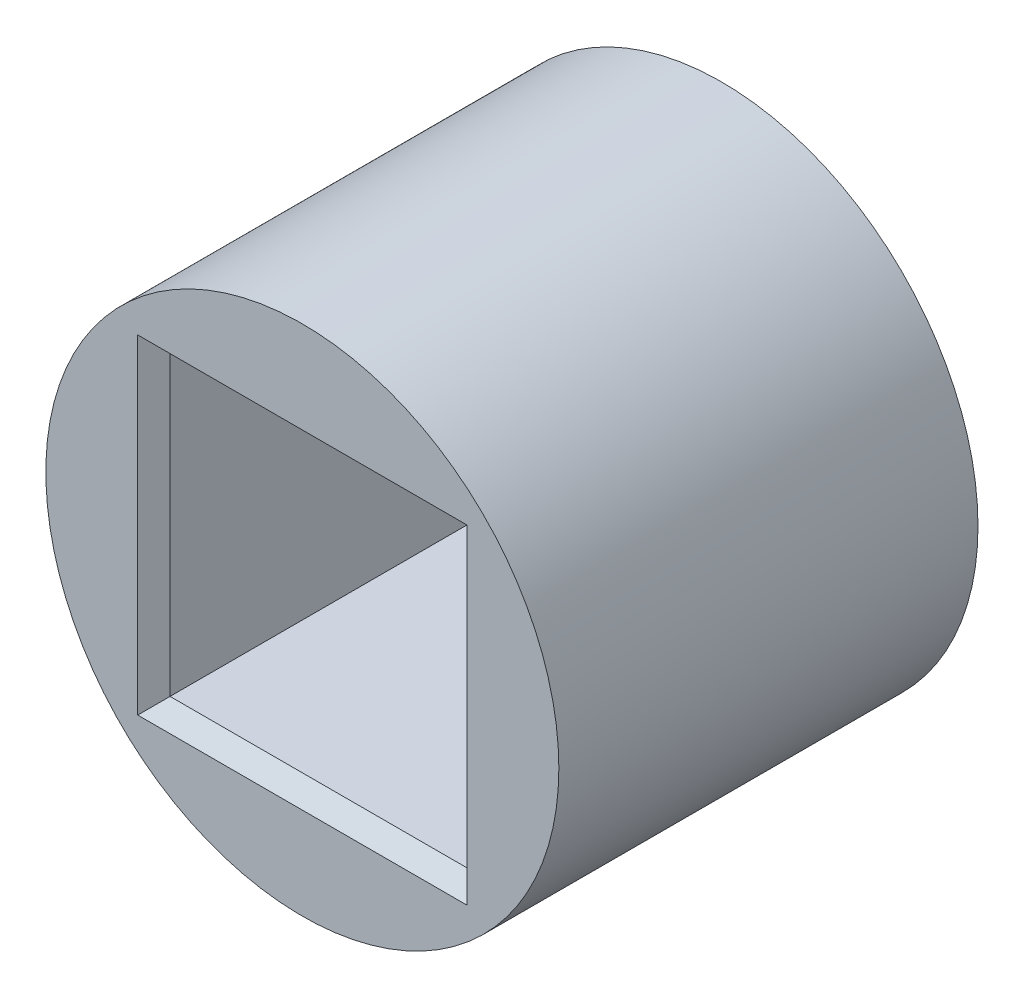
ISO-10303-21;
HEADER;
FILE_DESCRIPTION(('STEP AP214'),'2;1');
FILE_NAME('part.step','',(''),(''),'','','');
FILE_SCHEMA(('AUTOMOTIVE_DESIGN { 1 0 10303 214 1 1 1 1 }'));
ENDSEC;
DATA;
#1=APPLICATION_CONTEXT('core data for automotive mechanical design processes');
#2=APPLICATION_PROTOCOL_DEFINITION('international standard','automotive_design',2000,#1);
#3=PRODUCT_CONTEXT('',#1,'mechanical');
#4=PRODUCT('Part','Part','',(#3));
#5=PRODUCT_RELATED_PRODUCT_CATEGORY('part','',(#4));
#6=PRODUCT_DEFINITION_FORMATION('','',#4);
#7=PRODUCT_DEFINITION_CONTEXT('part definition',#1,'design');
#8=PRODUCT_DEFINITION('design','',#6,#7);
#9=PRODUCT_DEFINITION_SHAPE('','',#8);
#10=(LENGTH_UNIT() NAMED_UNIT(*) SI_UNIT(.MILLI.,.METRE.));
#11=(NAMED_UNIT(*) PLANE_ANGLE_UNIT() SI_UNIT($,.RADIAN.));
#12=(NAMED_UNIT(*) SI_UNIT($,.STERADIAN.) SOLID_ANGLE_UNIT());
#13=UNCERTAINTY_MEASURE_WITH_UNIT(LENGTH_MEASURE(1.E-05),#10,'distance_accuracy_value','');
#14=(GEOMETRIC_REPRESENTATION_CONTEXT(3) GLOBAL_UNCERTAINTY_ASSIGNED_CONTEXT((#13)) GLOBAL_UNIT_ASSIGNED_CONTEXT((#10,
#11,#12)) REPRESENTATION_CONTEXT('',''));
#15=CARTESIAN_POINT('',(0.,0.,0.));
#16=DIRECTION('',(0.,0.,1.));
#17=DIRECTION('',(1.,0.,0.));
#18=AXIS2_PLACEMENT_3D('',#15,#16,#17);
#19=CARTESIAN_POINT('',(0.,0.,5.188));
#20=DIRECTION('',(0.,0.,1.));
#21=DIRECTION('',(1.,0.,0.));
#22=AXIS2_PLACEMENT_3D('',#19,#20,#21);
#23=PLANE('',#22);
#24=DIRECTION('',(1.,0.,0.));
#25=VECTOR('',#24,1.);
#26=CARTESIAN_POINT('',(0.,2.0375,5.188));
#27=LINE('',#26,#25);
#28=CARTESIAN_POINT('',(-2.0375,2.0375,5.188));
#29=VERTEX_POINT('',#28);
#30=CARTESIAN_POINT('',(2.0375,2.0375,5.188));
#31=VERTEX_POINT('',#30);
#32=EDGE_CURVE('E42',#29,#31,#27,.T.);
#33=ORIENTED_EDGE('',*,*,#32,.T.);
#34=DIRECTION('',(0.,-1.,0.));
#35=VECTOR('',#34,1.);
#36=CARTESIAN_POINT('',(2.0375,0.,5.188));
#37=LINE('',#36,#35);
#38=CARTESIAN_POINT('',(2.0375,-2.0375,5.188));
#39=VERTEX_POINT('',#38);
#40=EDGE_CURVE('E11',#31,#39,#37,.T.);
#41=ORIENTED_EDGE('',*,*,#40,.T.);
#42=DIRECTION('',(-1.,0.,0.));
#43=VECTOR('',#42,1.);
#44=CARTESIAN_POINT('',(0.,-2.0375,5.188));
#45=LINE('',#44,#43);
#46=CARTESIAN_POINT('',(-2.0375,-2.0375,5.188));
#47=VERTEX_POINT('',#46);
#48=EDGE_CURVE('E149',#39,#47,#45,.T.);
#49=ORIENTED_EDGE('',*,*,#48,.T.);
#50=DIRECTION('',(0.,1.,0.));
#51=VECTOR('',#50,1.);
#52=CARTESIAN_POINT('',(-2.0375,0.,5.188));
#53=LINE('',#52,#51);
#54=EDGE_CURVE('E151',#47,#29,#53,.T.);
#55=ORIENTED_EDGE('',*,*,#54,.T.);
#56=EDGE_LOOP('',(#33,#41,#49,#55));
#57=FACE_BOUND('',#56,.T.);
#58=CARTESIAN_POINT('',(0.,0.,5.188));
#59=DIRECTION('',(0.,0.,1.));
#60=DIRECTION('',(1.,0.,0.));
#61=AXIS2_PLACEMENT_3D('',#58,#59,#60);
#62=CIRCLE('',#61,3.175);
#63=CARTESIAN_POINT('',(3.175,0.,5.188));
#64=VERTEX_POINT('',#63);
#65=EDGE_CURVE('E122',#64,#64,#62,.T.);
#66=ORIENTED_EDGE('',*,*,#65,.T.);
#67=EDGE_LOOP('',(#66));
#68=FACE_BOUND('',#67,.T.);
#69=ADVANCED_FACE('F33',(#57,#68),#23,.T.);
#70=CARTESIAN_POINT('',(0.,0.,0.));
#71=DIRECTION('',(0.,0.,1.));
#72=DIRECTION('',(1.,0.,0.));
#73=AXIS2_PLACEMENT_3D('',#70,#71,#72);
#74=PLANE('',#73);
#75=DIRECTION('',(0.,-1.,0.));
#76=VECTOR('',#75,1.);
#77=CARTESIAN_POINT('',(-2.0375,-1.8375,0.));
#78=LINE('',#77,#76);
#79=CARTESIAN_POINT('',(-2.0375,2.0375,0.));
#80=VERTEX_POINT('',#79);
#81=CARTESIAN_POINT('',(-2.0375,-2.0375,0.));
#82=VERTEX_POINT('',#81);
#83=EDGE_CURVE('E111',#80,#82,#78,.T.);
#84=ORIENTED_EDGE('',*,*,#83,.T.);
#85=DIRECTION('',(1.,0.,0.));
#86=VECTOR('',#85,1.);
#87=CARTESIAN_POINT('',(1.8375,-2.0375,0.));
#88=LINE('',#87,#86);
#89=CARTESIAN_POINT('',(2.0375,-2.0375,0.));
#90=VERTEX_POINT('',#89);
#91=EDGE_CURVE('E107',#82,#90,#88,.T.);
#92=ORIENTED_EDGE('',*,*,#91,.T.);
#93=DIRECTION('',(0.,1.,0.));
#94=VECTOR('',#93,1.);
#95=CARTESIAN_POINT('',(2.0375,1.8375,0.));
#96=LINE('',#95,#94);
#97=CARTESIAN_POINT('',(2.0375,2.0375,0.));
#98=VERTEX_POINT('',#97);
#99=EDGE_CURVE('E100',#90,#98,#96,.T.);
#100=ORIENTED_EDGE('',*,*,#99,.T.);
#101=DIRECTION('',(-1.,0.,0.));
#102=VECTOR('',#101,1.);
#103=CARTESIAN_POINT('',(-1.8375,2.0375,0.));
#104=LINE('',#103,#102);
#105=EDGE_CURVE('E104',#98,#80,#104,.T.);
#106=ORIENTED_EDGE('',*,*,#105,.T.);
#107=EDGE_LOOP('',(#84,#92,#100,#106));
#108=FACE_BOUND('',#107,.T.);
#109=CARTESIAN_POINT('',(0.,0.,0.));
#110=DIRECTION('',(0.,0.,1.));
#111=DIRECTION('',(1.,0.,0.));
#112=AXIS2_PLACEMENT_3D('',#109,#110,#111);
#113=CIRCLE('',#112,3.175);
#114=CARTESIAN_POINT('',(3.175,0.,0.));
#115=VERTEX_POINT('',#114);
#116=EDGE_CURVE('E172',#115,#115,#113,.T.);
#117=ORIENTED_EDGE('',*,*,#116,.F.);
#118=EDGE_LOOP('',(#117));
#119=FACE_BOUND('',#118,.T.);
#120=ADVANCED_FACE('F102',(#108,#119),#74,.F.);
#121=CARTESIAN_POINT('',(0.,0.,5.188));
#122=DIRECTION('',(0.,0.,-1.));
#123=DIRECTION('',(-1.,0.,0.));
#124=AXIS2_PLACEMENT_3D('',#121,#122,#123);
#125=CYLINDRICAL_SURFACE('',#124,3.175);
#126=ORIENTED_EDGE('',*,*,#65,.F.);
#127=EDGE_LOOP('',(#126));
#128=FACE_BOUND('',#127,.T.);
#129=ORIENTED_EDGE('',*,*,#116,.T.);
#130=EDGE_LOOP('',(#129));
#131=FACE_BOUND('',#130,.T.);
#132=ADVANCED_FACE('F223',(#128,#131),#125,.T.);
#133=CARTESIAN_POINT('',(1.8375,-1.8375,5.188));
#134=DIRECTION('',(-1.,0.,0.));
#135=DIRECTION('',(0.,0.,1.));
#136=AXIS2_PLACEMENT_3D('',#133,#134,#135);
#137=PLANE('',#136);
#138=DIRECTION('',(0.,0.,-1.));
#139=VECTOR('',#138,1.);
#140=CARTESIAN_POINT('',(1.8375,1.8375,5.188));
#141=LINE('',#140,#139);
#142=CARTESIAN_POINT('',(1.8375,1.8375,4.988));
#143=VERTEX_POINT('',#142);
#144=CARTESIAN_POINT('',(1.8375,1.8375,0.199999999999999));
#145=VERTEX_POINT('',#144);
#146=EDGE_CURVE('E175',#143,#145,#141,.T.);
#147=ORIENTED_EDGE('',*,*,#146,.T.);
#148=DIRECTION('',(0.,-1.,0.));
#149=VECTOR('',#148,1.);
#150=CARTESIAN_POINT('',(1.8375,-1.8375,0.199999999999999));
#151=LINE('',#150,#149);
#152=CARTESIAN_POINT('',(1.8375,-1.8375,0.199999999999999));
#153=VERTEX_POINT('',#152);
#154=EDGE_CURVE('E125',#145,#153,#151,.T.);
#155=ORIENTED_EDGE('',*,*,#154,.T.);
#156=DIRECTION('',(0.,0.,-1.));
#157=VECTOR('',#156,1.);
#158=CARTESIAN_POINT('',(1.8375,-1.8375,5.188));
#159=LINE('',#158,#157);
#160=CARTESIAN_POINT('',(1.8375,-1.8375,4.988));
#161=VERTEX_POINT('',#160);
#162=EDGE_CURVE('E128',#161,#153,#159,.T.);
#163=ORIENTED_EDGE('',*,*,#162,.F.);
#164=DIRECTION('',(0.,1.,0.));
#165=VECTOR('',#164,1.);
#166=CARTESIAN_POINT('',(1.8375,-1.8375,4.988));
#167=LINE('',#166,#165);
#168=EDGE_CURVE('E158',#161,#143,#167,.T.);
#169=ORIENTED_EDGE('',*,*,#168,.T.);
#170=EDGE_LOOP('',(#147,#155,#163,#169));
#171=FACE_BOUND('',#170,.T.);
#172=ADVANCED_FACE('F206',(#171),#137,.T.);
#173=CARTESIAN_POINT('',(-1.8375,1.8375,5.188));
#174=DIRECTION('',(0.,-1.,0.));
#175=DIRECTION('',(0.,0.,-1.));
#176=AXIS2_PLACEMENT_3D('',#173,#174,#175);
#177=PLANE('',#176);
#178=DIRECTION('',(0.,0.,-1.));
#179=VECTOR('',#178,1.);
#180=CARTESIAN_POINT('',(-1.8375,1.8375,5.188));
#181=LINE('',#180,#179);
#182=CARTESIAN_POINT('',(-1.8375,1.8375,4.988));
#183=VERTEX_POINT('',#182);
#184=CARTESIAN_POINT('',(-1.8375,1.8375,0.199999999999999));
#185=VERTEX_POINT('',#184);
#186=EDGE_CURVE('E180',#183,#185,#181,.T.);
#187=ORIENTED_EDGE('',*,*,#186,.T.);
#188=DIRECTION('',(1.,0.,0.));
#189=VECTOR('',#188,1.);
#190=CARTESIAN_POINT('',(1.8375,1.8375,0.199999999999999));
#191=LINE('',#190,#189);
#192=EDGE_CURVE('E153',#185,#145,#191,.T.);
#193=ORIENTED_EDGE('',*,*,#192,.T.);
#194=ORIENTED_EDGE('',*,*,#146,.F.);
#195=DIRECTION('',(-1.,0.,0.));
#196=VECTOR('',#195,1.);
#197=CARTESIAN_POINT('',(-1.8375,1.8375,4.988));
#198=LINE('',#197,#196);
#199=EDGE_CURVE('E155',#143,#183,#198,.T.);
#200=ORIENTED_EDGE('',*,*,#199,.T.);
#201=EDGE_LOOP('',(#187,#193,#194,#200));
#202=FACE_BOUND('',#201,.T.);
#203=ADVANCED_FACE('F202',(#202),#177,.T.);
#204=CARTESIAN_POINT('',(-1.8375,-1.8375,5.188));
#205=DIRECTION('',(1.,0.,0.));
#206=DIRECTION('',(0.,0.,-1.));
#207=AXIS2_PLACEMENT_3D('',#204,#205,#206);
#208=PLANE('',#207);
#209=DIRECTION('',(0.,0.,-1.));
#210=VECTOR('',#209,1.);
#211=CARTESIAN_POINT('',(-1.8375,-1.8375,5.188));
#212=LINE('',#211,#210);
#213=CARTESIAN_POINT('',(-1.8375,-1.8375,4.988));
#214=VERTEX_POINT('',#213);
#215=CARTESIAN_POINT('',(-1.8375,-1.8375,0.199999999999999));
#216=VERTEX_POINT('',#215);
#217=EDGE_CURVE('E183',#214,#216,#212,.T.);
#218=ORIENTED_EDGE('',*,*,#217,.T.);
#219=DIRECTION('',(0.,1.,0.));
#220=VECTOR('',#219,1.);
#221=CARTESIAN_POINT('',(-1.8375,1.8375,0.199999999999999));
#222=LINE('',#221,#220);
#223=EDGE_CURVE('E161',#216,#185,#222,.T.);
#224=ORIENTED_EDGE('',*,*,#223,.T.);
#225=ORIENTED_EDGE('',*,*,#186,.F.);
#226=DIRECTION('',(0.,-1.,0.));
#227=VECTOR('',#226,1.);
#228=CARTESIAN_POINT('',(-1.8375,-1.8375,4.988));
#229=LINE('',#228,#227);
#230=EDGE_CURVE('E163',#183,#214,#229,.T.);
#231=ORIENTED_EDGE('',*,*,#230,.T.);
#232=EDGE_LOOP('',(#218,#224,#225,#231));
#233=FACE_BOUND('',#232,.T.);
#234=ADVANCED_FACE('F199',(#233),#208,.T.);
#235=CARTESIAN_POINT('',(-1.8375,-1.8375,5.188));
#236=DIRECTION('',(0.,1.,0.));
#237=DIRECTION('',(0.,0.,1.));
#238=AXIS2_PLACEMENT_3D('',#235,#236,#237);
#239=PLANE('',#238);
#240=ORIENTED_EDGE('',*,*,#162,.T.);
#241=DIRECTION('',(-1.,0.,0.));
#242=VECTOR('',#241,1.);
#243=CARTESIAN_POINT('',(-1.8375,-1.8375,0.199999999999999));
#244=LINE('',#243,#242);
#245=EDGE_CURVE('E165',#153,#216,#244,.T.);
#246=ORIENTED_EDGE('',*,*,#245,.T.);
#247=ORIENTED_EDGE('',*,*,#217,.F.);
#248=DIRECTION('',(1.,0.,0.));
#249=VECTOR('',#248,1.);
#250=CARTESIAN_POINT('',(-1.8375,-1.8375,4.988));
#251=LINE('',#250,#249);
#252=EDGE_CURVE('E168',#214,#161,#251,.T.);
#253=ORIENTED_EDGE('',*,*,#252,.T.);
#254=EDGE_LOOP('',(#240,#246,#247,#253));
#255=FACE_BOUND('',#254,.T.);
#256=ADVANCED_FACE('F189',(#255),#239,.T.);
#257=CARTESIAN_POINT('',(0.,2.0375,0.));
#258=DIRECTION('',(0.,-0.707106781186548,-0.707106781186548));
#259=DIRECTION('',(1.,0.,0.));
#260=AXIS2_PLACEMENT_3D('',#257,#258,#259);
#261=PLANE('',#260);
#262=DIRECTION('',(-0.577350269189626,-0.577350269189626,0.577350269189626));
#263=VECTOR('',#262,1.);
#264=CARTESIAN_POINT('',(1.35833333333333,1.35833333333333,0.679166666666666));
#265=LINE('',#264,#263);
#266=EDGE_CURVE('E117',#145,#98,#265,.F.);
#267=ORIENTED_EDGE('',*,*,#266,.F.);
#268=ORIENTED_EDGE('',*,*,#192,.F.);
#269=DIRECTION('',(-0.577350269189626,0.577350269189626,-0.577350269189626));
#270=VECTOR('',#269,1.);
#271=CARTESIAN_POINT('',(-1.35833333333333,1.35833333333333,0.679166666666666));
#272=LINE('',#271,#270);
#273=EDGE_CURVE('E120',#80,#185,#272,.F.);
#274=ORIENTED_EDGE('',*,*,#273,.F.);
#275=ORIENTED_EDGE('',*,*,#105,.F.);
#276=EDGE_LOOP('',(#267,#268,#274,#275));
#277=FACE_BOUND('',#276,.T.);
#278=ADVANCED_FACE('F115',(#277),#261,.T.);
#279=CARTESIAN_POINT('',(-2.0375,0.,0.));
#280=DIRECTION('',(0.707106781186548,0.,-0.707106781186548));
#281=DIRECTION('',(0.,1.,0.));
#282=AXIS2_PLACEMENT_3D('',#279,#280,#281);
#283=PLANE('',#282);
#284=ORIENTED_EDGE('',*,*,#273,.T.);
#285=ORIENTED_EDGE('',*,*,#223,.F.);
#286=DIRECTION('',(-0.577350269189626,-0.577350269189626,-0.577350269189626));
#287=VECTOR('',#286,1.);
#288=CARTESIAN_POINT('',(-1.35833333333333,-1.35833333333333,0.679166666666666));
#289=LINE('',#288,#287);
#290=EDGE_CURVE('E126',#82,#216,#289,.F.);
#291=ORIENTED_EDGE('',*,*,#290,.F.);
#292=ORIENTED_EDGE('',*,*,#83,.F.);
#293=EDGE_LOOP('',(#284,#285,#291,#292));
#294=FACE_BOUND('',#293,.T.);
#295=ADVANCED_FACE('F196',(#294),#283,.T.);
#296=CARTESIAN_POINT('',(2.0375,0.,0.));
#297=DIRECTION('',(-0.707106781186548,0.,-0.707106781186548));
#298=DIRECTION('',(0.,-1.,0.));
#299=AXIS2_PLACEMENT_3D('',#296,#297,#298);
#300=PLANE('',#299);
#301=ORIENTED_EDGE('',*,*,#266,.T.);
#302=ORIENTED_EDGE('',*,*,#99,.F.);
#303=DIRECTION('',(-0.577350269189626,0.577350269189626,0.577350269189626));
#304=VECTOR('',#303,1.);
#305=CARTESIAN_POINT('',(1.35833333333333,-1.35833333333333,0.679166666666666));
#306=LINE('',#305,#304);
#307=EDGE_CURVE('E130',#153,#90,#306,.F.);
#308=ORIENTED_EDGE('',*,*,#307,.F.);
#309=ORIENTED_EDGE('',*,*,#154,.F.);
#310=EDGE_LOOP('',(#301,#302,#308,#309));
#311=FACE_BOUND('',#310,.T.);
#312=ADVANCED_FACE('F124',(#311),#300,.T.);
#313=CARTESIAN_POINT('',(0.,-2.0375,0.));
#314=DIRECTION('',(0.,0.707106781186548,-0.707106781186548));
#315=DIRECTION('',(-1.,0.,0.));
#316=AXIS2_PLACEMENT_3D('',#313,#314,#315);
#317=PLANE('',#316);
#318=ORIENTED_EDGE('',*,*,#290,.T.);
#319=ORIENTED_EDGE('',*,*,#245,.F.);
#320=ORIENTED_EDGE('',*,*,#307,.T.);
#321=ORIENTED_EDGE('',*,*,#91,.F.);
#322=EDGE_LOOP('',(#318,#319,#320,#321));
#323=FACE_BOUND('',#322,.T.);
#324=ADVANCED_FACE('F192',(#323),#317,.T.);
#325=CARTESIAN_POINT('',(-1.8375,-1.8375,4.988));
#326=DIRECTION('',(-0.707106781186548,0.,-0.707106781186548));
#327=DIRECTION('',(0.,-1.,0.));
#328=AXIS2_PLACEMENT_3D('',#325,#326,#327);
#329=PLANE('',#328);
#330=DIRECTION('',(-0.577350269189626,0.577350269189626,0.577350269189626));
#331=VECTOR('',#330,1.);
#332=CARTESIAN_POINT('',(-1.8375,1.8375,4.988));
#333=LINE('',#332,#331);
#334=EDGE_CURVE('E136',#29,#183,#333,.F.);
#335=ORIENTED_EDGE('',*,*,#334,.F.);
#336=ORIENTED_EDGE('',*,*,#54,.F.);
#337=DIRECTION('',(0.577350269189626,0.577350269189626,-0.577350269189626));
#338=VECTOR('',#337,1.);
#339=CARTESIAN_POINT('',(-1.8375,-1.8375,4.988));
#340=LINE('',#339,#338);
#341=EDGE_CURVE('E37',#214,#47,#340,.F.);
#342=ORIENTED_EDGE('',*,*,#341,.F.);
#343=ORIENTED_EDGE('',*,*,#230,.F.);
#344=EDGE_LOOP('',(#335,#336,#342,#343));
#345=FACE_BOUND('',#344,.T.);
#346=ADVANCED_FACE('F35',(#345),#329,.F.);
#347=CARTESIAN_POINT('',(-1.8375,-1.8375,4.988));
#348=DIRECTION('',(0.,-0.707106781186548,-0.707106781186548));
#349=DIRECTION('',(1.,0.,0.));
#350=AXIS2_PLACEMENT_3D('',#347,#348,#349);
#351=PLANE('',#350);
#352=ORIENTED_EDGE('',*,*,#341,.T.);
#353=ORIENTED_EDGE('',*,*,#48,.F.);
#354=DIRECTION('',(-0.577350269189626,0.577350269189626,-0.577350269189626));
#355=VECTOR('',#354,1.);
#356=CARTESIAN_POINT('',(1.8375,-1.8375,4.988));
#357=LINE('',#356,#355);
#358=EDGE_CURVE('E55',#161,#39,#357,.F.);
#359=ORIENTED_EDGE('',*,*,#358,.F.);
#360=ORIENTED_EDGE('',*,*,#252,.F.);
#361=EDGE_LOOP('',(#352,#353,#359,#360));
#362=FACE_BOUND('',#361,.T.);
#363=ADVANCED_FACE('F211',(#362),#351,.F.);
#364=CARTESIAN_POINT('',(-1.8375,1.8375,4.988));
#365=DIRECTION('',(0.,0.707106781186548,-0.707106781186548));
#366=DIRECTION('',(-1.,0.,0.));
#367=AXIS2_PLACEMENT_3D('',#364,#365,#366);
#368=PLANE('',#367);
#369=ORIENTED_EDGE('',*,*,#334,.T.);
#370=ORIENTED_EDGE('',*,*,#199,.F.);
#371=DIRECTION('',(0.577350269189626,0.577350269189626,0.577350269189626));
#372=VECTOR('',#371,1.);
#373=CARTESIAN_POINT('',(0.6125,0.6125,3.763));
#374=LINE('',#373,#372);
#375=EDGE_CURVE('E134',#31,#143,#374,.F.);
#376=ORIENTED_EDGE('',*,*,#375,.F.);
#377=ORIENTED_EDGE('',*,*,#32,.F.);
#378=EDGE_LOOP('',(#369,#370,#376,#377));
#379=FACE_BOUND('',#378,.T.);
#380=ADVANCED_FACE('F205',(#379),#368,.F.);
#381=CARTESIAN_POINT('',(1.8375,-1.8375,4.988));
#382=DIRECTION('',(0.707106781186548,0.,-0.707106781186548));
#383=DIRECTION('',(0.,1.,0.));
#384=AXIS2_PLACEMENT_3D('',#381,#382,#383);
#385=PLANE('',#384);
#386=ORIENTED_EDGE('',*,*,#358,.T.);
#387=ORIENTED_EDGE('',*,*,#40,.F.);
#388=ORIENTED_EDGE('',*,*,#375,.T.);
#389=ORIENTED_EDGE('',*,*,#168,.F.);
#390=EDGE_LOOP('',(#386,#387,#388,#389));
#391=FACE_BOUND('',#390,.T.);
#392=ADVANCED_FACE('F207',(#391),#385,.F.);
#393=CLOSED_SHELL('',(#69,#120,#132,#172,#203,#234,#256,#278,#295,#312,#324,#346,#363,#380,#392));
#394=MANIFOLD_SOLID_BREP('B2',#393);
#395=ADVANCED_BREP_SHAPE_REPRESENTATION('',(#18,#394),#14);
#396=SHAPE_DEFINITION_REPRESENTATION(#9,#395);
ENDSEC;
END-ISO-10303-21;
